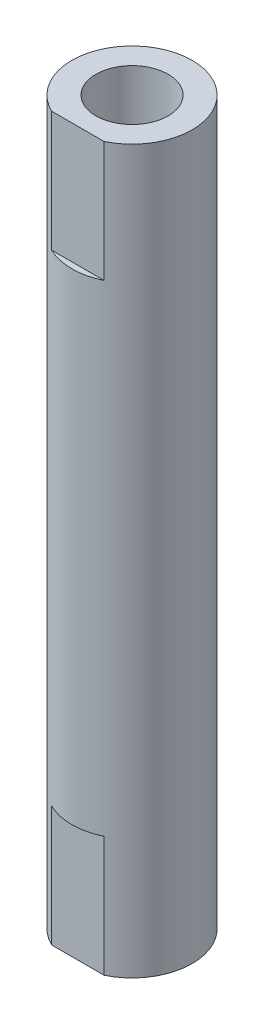
ISO-10303-21;
HEADER;
FILE_DESCRIPTION(('STEP AP214'),'2;1');
FILE_NAME('part.step','',(''),(''),'','','');
FILE_SCHEMA(('AUTOMOTIVE_DESIGN { 1 0 10303 214 1 1 1 1 }'));
ENDSEC;
DATA;
#1=APPLICATION_CONTEXT('core data for automotive mechanical design processes');
#2=APPLICATION_PROTOCOL_DEFINITION('international standard','automotive_design',2000,#1);
#3=PRODUCT_CONTEXT('',#1,'mechanical');
#4=PRODUCT('Part','Part','',(#3));
#5=PRODUCT_RELATED_PRODUCT_CATEGORY('part','',(#4));
#6=PRODUCT_DEFINITION_FORMATION('','',#4);
#7=PRODUCT_DEFINITION_CONTEXT('part definition',#1,'design');
#8=PRODUCT_DEFINITION('design','',#6,#7);
#9=PRODUCT_DEFINITION_SHAPE('','',#8);
#10=(LENGTH_UNIT() NAMED_UNIT(*) SI_UNIT(.MILLI.,.METRE.));
#11=(NAMED_UNIT(*) PLANE_ANGLE_UNIT() SI_UNIT($,.RADIAN.));
#12=(NAMED_UNIT(*) SI_UNIT($,.STERADIAN.) SOLID_ANGLE_UNIT());
#13=UNCERTAINTY_MEASURE_WITH_UNIT(LENGTH_MEASURE(1.E-05),#10,'distance_accuracy_value','');
#14=(GEOMETRIC_REPRESENTATION_CONTEXT(3) GLOBAL_UNCERTAINTY_ASSIGNED_CONTEXT((#13)) GLOBAL_UNIT_ASSIGNED_CONTEXT((#10,
#11,#12)) REPRESENTATION_CONTEXT('',''));
#15=CARTESIAN_POINT('',(0.,0.,0.));
#16=DIRECTION('',(0.,0.,1.));
#17=DIRECTION('',(1.,0.,0.));
#18=AXIS2_PLACEMENT_3D('',#15,#16,#17);
#19=CARTESIAN_POINT('',(0.,30.,0.));
#20=DIRECTION('',(0.,1.,0.));
#21=DIRECTION('',(0.,0.,1.));
#22=AXIS2_PLACEMENT_3D('',#19,#20,#21);
#23=PLANE('',#22);
#24=CARTESIAN_POINT('',(0.,30.,0.));
#25=DIRECTION('',(0.,1.,0.));
#26=DIRECTION('',(0.,0.,1.));
#27=AXIS2_PLACEMENT_3D('',#24,#25,#26);
#28=CIRCLE('',#27,3.);
#29=CARTESIAN_POINT('',(0.,30.,3.));
#30=VERTEX_POINT('',#29);
#31=EDGE_CURVE('E100',#30,#30,#28,.T.);
#32=ORIENTED_EDGE('',*,*,#31,.F.);
#33=EDGE_LOOP('',(#32));
#34=FACE_BOUND('',#33,.T.);
#35=CARTESIAN_POINT('',(0.,30.,0.));
#36=DIRECTION('',(0.,1.,0.));
#37=DIRECTION('',(0.,0.,1.));
#38=AXIS2_PLACEMENT_3D('',#35,#36,#37);
#39=CIRCLE('',#38,5.);
#40=CARTESIAN_POINT('',(2.17944947177034,30.,4.5));
#41=VERTEX_POINT('',#40);
#42=CARTESIAN_POINT('',(-2.17944947177034,30.,4.5));
#43=VERTEX_POINT('',#42);
#44=EDGE_CURVE('E11',#41,#43,#39,.T.);
#45=ORIENTED_EDGE('',*,*,#44,.T.);
#46=DIRECTION('',(1.,0.,0.));
#47=VECTOR('',#46,1.);
#48=CARTESIAN_POINT('',(-2.17944947177034,30.,4.5));
#49=LINE('',#48,#47);
#50=EDGE_CURVE('E82',#43,#41,#49,.T.);
#51=ORIENTED_EDGE('',*,*,#50,.T.);
#52=EDGE_LOOP('',(#45,#51));
#53=FACE_BOUND('',#52,.T.);
#54=ADVANCED_FACE('F32',(#34,#53),#23,.T.);
#55=CARTESIAN_POINT('',(0.,30.,0.));
#56=DIRECTION('',(0.,-1.,0.));
#57=DIRECTION('',(0.,0.,-1.));
#58=AXIS2_PLACEMENT_3D('',#55,#56,#57);
#59=CYLINDRICAL_SURFACE('',#58,5.);
#60=CARTESIAN_POINT('',(0.,-20.,0.));
#61=DIRECTION('',(0.,-1.,0.));
#62=DIRECTION('',(0.,0.,-1.));
#63=AXIS2_PLACEMENT_3D('',#60,#61,#62);
#64=CIRCLE('',#63,5.);
#65=CARTESIAN_POINT('',(2.17944947177034,-20.,4.5));
#66=VERTEX_POINT('',#65);
#67=CARTESIAN_POINT('',(-2.17944947177034,-20.,4.5));
#68=VERTEX_POINT('',#67);
#69=EDGE_CURVE('E90',#66,#68,#64,.T.);
#70=ORIENTED_EDGE('',*,*,#69,.F.);
#71=DIRECTION('',(0.,-1.,0.));
#72=VECTOR('',#71,1.);
#73=CARTESIAN_POINT('',(2.17944947177034,-20.,4.5));
#74=LINE('',#73,#72);
#75=CARTESIAN_POINT('',(2.17944947177034,-30.,4.5));
#76=VERTEX_POINT('',#75);
#77=EDGE_CURVE('E95',#66,#76,#74,.T.);
#78=ORIENTED_EDGE('',*,*,#77,.T.);
#79=CARTESIAN_POINT('',(0.,-30.,0.));
#80=DIRECTION('',(0.,1.,0.));
#81=DIRECTION('',(0.,0.,1.));
#82=AXIS2_PLACEMENT_3D('',#79,#80,#81);
#83=CIRCLE('',#82,5.);
#84=CARTESIAN_POINT('',(-2.17944947177034,-30.,4.5));
#85=VERTEX_POINT('',#84);
#86=EDGE_CURVE('E36',#76,#85,#83,.T.);
#87=ORIENTED_EDGE('',*,*,#86,.T.);
#88=DIRECTION('',(0.,-1.,0.));
#89=VECTOR('',#88,1.);
#90=CARTESIAN_POINT('',(-2.17944947177034,-20.,4.5));
#91=LINE('',#90,#89);
#92=EDGE_CURVE('E93',#68,#85,#91,.T.);
#93=ORIENTED_EDGE('',*,*,#92,.F.);
#94=EDGE_LOOP('',(#70,#78,#87,#93));
#95=FACE_BOUND('',#94,.T.);
#96=DIRECTION('',(0.,1.,0.));
#97=VECTOR('',#96,1.);
#98=CARTESIAN_POINT('',(-2.17944947177034,20.,4.5));
#99=LINE('',#98,#97);
#100=CARTESIAN_POINT('',(-2.17944947177034,20.,4.5));
#101=VERTEX_POINT('',#100);
#102=EDGE_CURVE('E47',#101,#43,#99,.T.);
#103=ORIENTED_EDGE('',*,*,#102,.T.);
#104=ORIENTED_EDGE('',*,*,#44,.F.);
#105=DIRECTION('',(0.,1.,0.));
#106=VECTOR('',#105,1.);
#107=CARTESIAN_POINT('',(2.17944947177034,20.,4.5));
#108=LINE('',#107,#106);
#109=CARTESIAN_POINT('',(2.17944947177034,20.,4.5));
#110=VERTEX_POINT('',#109);
#111=EDGE_CURVE('E74',#110,#41,#108,.T.);
#112=ORIENTED_EDGE('',*,*,#111,.F.);
#113=CARTESIAN_POINT('',(0.,20.,0.));
#114=DIRECTION('',(0.,-1.,0.));
#115=DIRECTION('',(0.,0.,-1.));
#116=AXIS2_PLACEMENT_3D('',#113,#114,#115);
#117=CIRCLE('',#116,5.);
#118=EDGE_CURVE('E78',#110,#101,#117,.T.);
#119=ORIENTED_EDGE('',*,*,#118,.T.);
#120=EDGE_LOOP('',(#103,#104,#112,#119));
#121=FACE_BOUND('',#120,.T.);
#122=ADVANCED_FACE('F34',(#95,#121),#59,.T.);
#123=CARTESIAN_POINT('',(0.,-30.,0.));
#124=DIRECTION('',(0.,1.,0.));
#125=DIRECTION('',(0.,0.,1.));
#126=AXIS2_PLACEMENT_3D('',#123,#124,#125);
#127=PLANE('',#126);
#128=ORIENTED_EDGE('',*,*,#86,.F.);
#129=DIRECTION('',(1.,0.,0.));
#130=VECTOR('',#129,1.);
#131=CARTESIAN_POINT('',(-2.17944947177034,-30.,4.5));
#132=LINE('',#131,#130);
#133=EDGE_CURVE('E86',#85,#76,#132,.T.);
#134=ORIENTED_EDGE('',*,*,#133,.F.);
#135=EDGE_LOOP('',(#128,#134));
#136=FACE_BOUND('',#135,.T.);
#137=CARTESIAN_POINT('',(0.,-30.,0.));
#138=DIRECTION('',(0.,1.,0.));
#139=DIRECTION('',(0.,0.,1.));
#140=AXIS2_PLACEMENT_3D('',#137,#138,#139);
#141=CIRCLE('',#140,3.);
#142=CARTESIAN_POINT('',(0.,-30.,3.));
#143=VERTEX_POINT('',#142);
#144=EDGE_CURVE('E98',#143,#143,#141,.T.);
#145=ORIENTED_EDGE('',*,*,#144,.T.);
#146=EDGE_LOOP('',(#145));
#147=FACE_BOUND('',#146,.T.);
#148=ADVANCED_FACE('F106',(#136,#147),#127,.F.);
#149=CARTESIAN_POINT('',(0.,30.,0.));
#150=DIRECTION('',(0.,-1.,0.));
#151=DIRECTION('',(0.,0.,-1.));
#152=AXIS2_PLACEMENT_3D('',#149,#150,#151);
#153=CYLINDRICAL_SURFACE('',#152,3.);
#154=ORIENTED_EDGE('',*,*,#31,.T.);
#155=EDGE_LOOP('',(#154));
#156=FACE_BOUND('',#155,.T.);
#157=ORIENTED_EDGE('',*,*,#144,.F.);
#158=EDGE_LOOP('',(#157));
#159=FACE_BOUND('',#158,.T.);
#160=ADVANCED_FACE('F108',(#156,#159),#153,.F.);
#161=CARTESIAN_POINT('',(-2.17944947177034,-20.,4.5));
#162=DIRECTION('',(0.,0.,-1.));
#163=DIRECTION('',(-1.,0.,0.));
#164=AXIS2_PLACEMENT_3D('',#161,#162,#163);
#165=PLANE('',#164);
#166=ORIENTED_EDGE('',*,*,#133,.T.);
#167=ORIENTED_EDGE('',*,*,#77,.F.);
#168=DIRECTION('',(1.,0.,0.));
#169=VECTOR('',#168,1.);
#170=CARTESIAN_POINT('',(-2.17944947177034,-20.,4.5));
#171=LINE('',#170,#169);
#172=EDGE_CURVE('E54',#68,#66,#171,.T.);
#173=ORIENTED_EDGE('',*,*,#172,.F.);
#174=ORIENTED_EDGE('',*,*,#92,.T.);
#175=EDGE_LOOP('',(#166,#167,#173,#174));
#176=FACE_BOUND('',#175,.T.);
#177=ADVANCED_FACE('F110',(#176),#165,.F.);
#178=CARTESIAN_POINT('',(0.,-20.,0.));
#179=DIRECTION('',(0.,-1.,0.));
#180=DIRECTION('',(0.,0.,-1.));
#181=AXIS2_PLACEMENT_3D('',#178,#179,#180);
#182=PLANE('',#181);
#183=ORIENTED_EDGE('',*,*,#69,.T.);
#184=ORIENTED_EDGE('',*,*,#172,.T.);
#185=EDGE_LOOP('',(#183,#184));
#186=FACE_BOUND('',#185,.T.);
#187=ADVANCED_FACE('F117',(#186),#182,.T.);
#188=CARTESIAN_POINT('',(-2.17944947177034,20.,4.5));
#189=DIRECTION('',(0.,0.,1.));
#190=DIRECTION('',(1.,0.,0.));
#191=AXIS2_PLACEMENT_3D('',#188,#189,#190);
#192=PLANE('',#191);
#193=ORIENTED_EDGE('',*,*,#50,.F.);
#194=ORIENTED_EDGE('',*,*,#102,.F.);
#195=DIRECTION('',(1.,0.,0.));
#196=VECTOR('',#195,1.);
#197=CARTESIAN_POINT('',(-2.17944947177034,20.,4.5));
#198=LINE('',#197,#196);
#199=EDGE_CURVE('E70',#101,#110,#198,.T.);
#200=ORIENTED_EDGE('',*,*,#199,.T.);
#201=ORIENTED_EDGE('',*,*,#111,.T.);
#202=EDGE_LOOP('',(#193,#194,#200,#201));
#203=FACE_BOUND('',#202,.T.);
#204=ADVANCED_FACE('F72',(#203),#192,.T.);
#205=CARTESIAN_POINT('',(0.,20.,0.));
#206=DIRECTION('',(0.,1.,0.));
#207=DIRECTION('',(0.,0.,-1.));
#208=AXIS2_PLACEMENT_3D('',#205,#206,#207);
#209=PLANE('',#208);
#210=ORIENTED_EDGE('',*,*,#118,.F.);
#211=ORIENTED_EDGE('',*,*,#199,.F.);
#212=EDGE_LOOP('',(#210,#211));
#213=FACE_BOUND('',#212,.T.);
#214=ADVANCED_FACE('F80',(#213),#209,.T.);
#215=CLOSED_SHELL('',(#54,#122,#148,#160,#177,#187,#204,#214));
#216=MANIFOLD_SOLID_BREP('B2',#215);
#217=ADVANCED_BREP_SHAPE_REPRESENTATION('',(#18,#216),#14);
#218=SHAPE_DEFINITION_REPRESENTATION(#9,#217);
ENDSEC;
END-ISO-10303-21;
